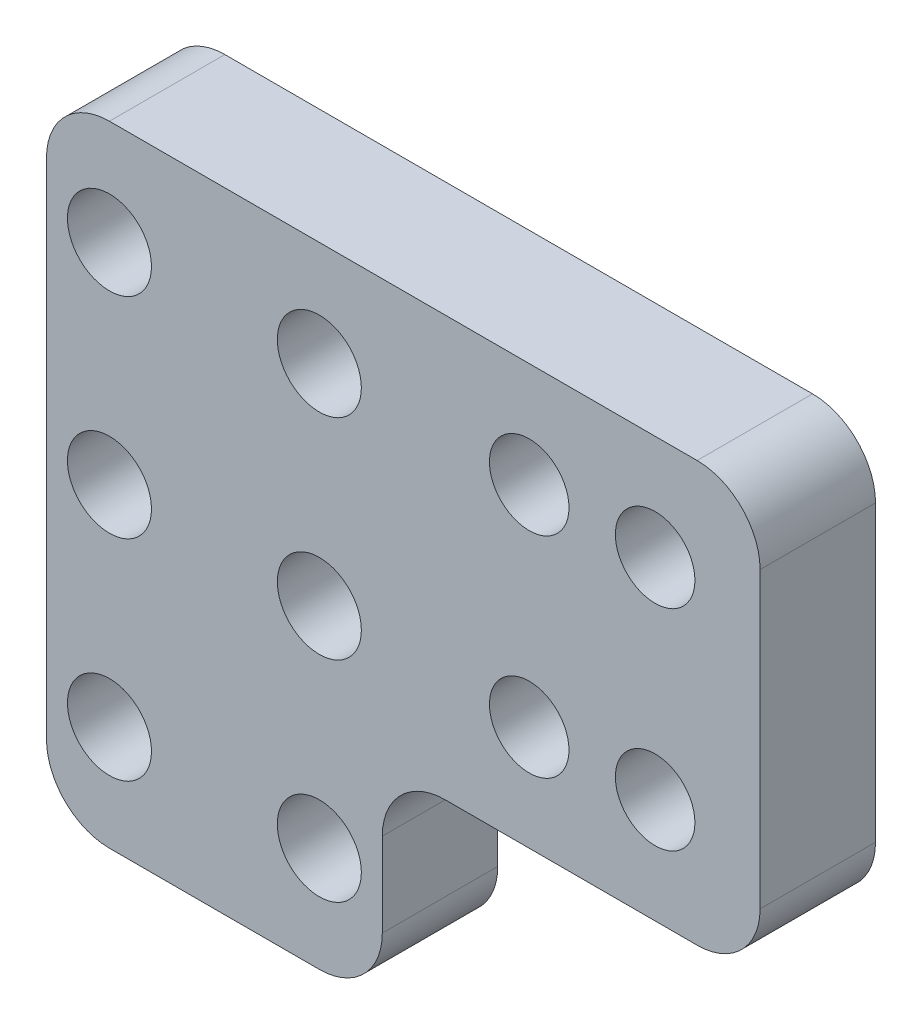
ISO-10303-21;
HEADER;
FILE_DESCRIPTION(('STEP AP214'),'2;1');
FILE_NAME('part.step','',(''),(''),'','','');
FILE_SCHEMA(('AUTOMOTIVE_DESIGN { 1 0 10303 214 1 1 1 1 }'));
ENDSEC;
DATA;
#1=APPLICATION_CONTEXT('core data for automotive mechanical design processes');
#2=APPLICATION_PROTOCOL_DEFINITION('international standard','automotive_design',2000,#1);
#3=PRODUCT_CONTEXT('',#1,'mechanical');
#4=PRODUCT('Part','Part','',(#3));
#5=PRODUCT_RELATED_PRODUCT_CATEGORY('part','',(#4));
#6=PRODUCT_DEFINITION_FORMATION('','',#4);
#7=PRODUCT_DEFINITION_CONTEXT('part definition',#1,'design');
#8=PRODUCT_DEFINITION('design','',#6,#7);
#9=PRODUCT_DEFINITION_SHAPE('','',#8);
#10=(LENGTH_UNIT() NAMED_UNIT(*) SI_UNIT(.MILLI.,.METRE.));
#11=(NAMED_UNIT(*) PLANE_ANGLE_UNIT() SI_UNIT($,.RADIAN.));
#12=(NAMED_UNIT(*) SI_UNIT($,.STERADIAN.) SOLID_ANGLE_UNIT());
#13=UNCERTAINTY_MEASURE_WITH_UNIT(LENGTH_MEASURE(1.E-05),#10,'distance_accuracy_value','');
#14=(GEOMETRIC_REPRESENTATION_CONTEXT(3) GLOBAL_UNCERTAINTY_ASSIGNED_CONTEXT((#13)) GLOBAL_UNIT_ASSIGNED_CONTEXT((#10,
#11,#12)) REPRESENTATION_CONTEXT('',''));
#15=CARTESIAN_POINT('',(0.,0.,0.));
#16=DIRECTION('',(0.,0.,1.));
#17=DIRECTION('',(1.,0.,0.));
#18=AXIS2_PLACEMENT_3D('',#15,#16,#17);
#19=CARTESIAN_POINT('',(0.,0.,5.5));
#20=DIRECTION('',(0.,0.,1.));
#21=DIRECTION('',(1.,0.,0.));
#22=AXIS2_PLACEMENT_3D('',#19,#20,#21);
#23=PLANE('',#22);
#24=CARTESIAN_POINT('',(21.0000000000001,0.,5.5));
#25=DIRECTION('',(0.,0.,1.));
#26=DIRECTION('',(1.,0.,0.));
#27=AXIS2_PLACEMENT_3D('',#24,#25,#26);
#28=CIRCLE('',#27,1.8951052821109);
#29=CARTESIAN_POINT('',(22.895105282111,0.,5.5));
#30=VERTEX_POINT('',#29);
#31=EDGE_CURVE('E283',#30,#30,#28,.T.);
#32=ORIENTED_EDGE('',*,*,#31,.F.);
#33=EDGE_LOOP('',(#32));
#34=FACE_BOUND('',#33,.T.);
#35=CARTESIAN_POINT('',(-4.99999999999979,-9.99999999999999,5.5));
#36=DIRECTION('',(0.,0.,1.));
#37=DIRECTION('',(1.,0.,0.));
#38=AXIS2_PLACEMENT_3D('',#35,#36,#37);
#39=CIRCLE('',#38,2.00172757422963);
#40=CARTESIAN_POINT('',(-2.99827242577017,-9.99999999999999,5.5));
#41=VERTEX_POINT('',#40);
#42=EDGE_CURVE('E271',#41,#41,#39,.T.);
#43=ORIENTED_EDGE('',*,*,#42,.F.);
#44=EDGE_LOOP('',(#43));
#45=FACE_BOUND('',#44,.T.);
#46=CARTESIAN_POINT('',(5.00000000000021,-9.99999999999999,5.5));
#47=DIRECTION('',(0.,0.,1.));
#48=DIRECTION('',(1.,0.,0.));
#49=AXIS2_PLACEMENT_3D('',#46,#47,#48);
#50=CIRCLE('',#49,2.00172757422963);
#51=CARTESIAN_POINT('',(7.00172757422984,-9.99999999999999,5.5));
#52=VERTEX_POINT('',#51);
#53=EDGE_CURVE('E259',#52,#52,#50,.T.);
#54=ORIENTED_EDGE('',*,*,#53,.F.);
#55=EDGE_LOOP('',(#54));
#56=FACE_BOUND('',#55,.T.);
#57=CARTESIAN_POINT('',(5.,10.,5.5));
#58=DIRECTION('',(0.,0.,1.));
#59=DIRECTION('',(1.,0.,0.));
#60=AXIS2_PLACEMENT_3D('',#57,#58,#59);
#61=CIRCLE('',#60,2.00172757422963);
#62=CARTESIAN_POINT('',(7.00172757422963,10.,5.5));
#63=VERTEX_POINT('',#62);
#64=EDGE_CURVE('E247',#63,#63,#61,.T.);
#65=ORIENTED_EDGE('',*,*,#64,.F.);
#66=EDGE_LOOP('',(#65));
#67=FACE_BOUND('',#66,.T.);
#68=CARTESIAN_POINT('',(-5.,10.,5.5));
#69=DIRECTION('',(0.,0.,1.));
#70=DIRECTION('',(1.,0.,0.));
#71=AXIS2_PLACEMENT_3D('',#68,#69,#70);
#72=CIRCLE('',#71,2.00172757422963);
#73=CARTESIAN_POINT('',(-2.99827242577037,10.,5.5));
#74=VERTEX_POINT('',#73);
#75=EDGE_CURVE('E159',#74,#74,#72,.T.);
#76=ORIENTED_EDGE('',*,*,#75,.F.);
#77=EDGE_LOOP('',(#76));
#78=FACE_BOUND('',#77,.T.);
#79=DIRECTION('',(1.,0.,0.));
#80=VECTOR('',#79,1.);
#81=CARTESIAN_POINT('',(-8.,-15.,5.5));
#82=LINE('',#81,#80);
#83=CARTESIAN_POINT('',(-5.,-15.,5.5));
#84=VERTEX_POINT('',#83);
#85=CARTESIAN_POINT('',(5.,-15.,5.5));
#86=VERTEX_POINT('',#85);
#87=EDGE_CURVE('E168',#84,#86,#82,.T.);
#88=ORIENTED_EDGE('',*,*,#87,.T.);
#89=CARTESIAN_POINT('',(5.,-12.,5.5));
#90=DIRECTION('',(0.,0.,1.));
#91=DIRECTION('',(1.,0.,0.));
#92=AXIS2_PLACEMENT_3D('',#89,#90,#91);
#93=CIRCLE('',#92,3.);
#94=CARTESIAN_POINT('',(8.,-12.,5.5));
#95=VERTEX_POINT('',#94);
#96=EDGE_CURVE('E197',#86,#95,#93,.T.);
#97=ORIENTED_EDGE('',*,*,#96,.T.);
#98=DIRECTION('',(0.,1.,0.));
#99=VECTOR('',#98,1.);
#100=CARTESIAN_POINT('',(8.,-5.,5.5));
#101=LINE('',#100,#99);
#102=CARTESIAN_POINT('',(8.,-8.,5.5));
#103=VERTEX_POINT('',#102);
#104=EDGE_CURVE('E151',#95,#103,#101,.T.);
#105=ORIENTED_EDGE('',*,*,#104,.T.);
#106=CARTESIAN_POINT('',(11.,-8.,5.5));
#107=DIRECTION('',(0.,0.,1.));
#108=DIRECTION('',(1.,0.,0.));
#109=AXIS2_PLACEMENT_3D('',#106,#107,#108);
#110=CIRCLE('',#109,3.);
#111=CARTESIAN_POINT('',(11.,-5.,5.5));
#112=VERTEX_POINT('',#111);
#113=EDGE_CURVE('E11',#103,#112,#110,.F.);
#114=ORIENTED_EDGE('',*,*,#113,.T.);
#115=DIRECTION('',(1.,0.,0.));
#116=VECTOR('',#115,1.);
#117=CARTESIAN_POINT('',(26.,-5.,5.5));
#118=LINE('',#117,#116);
#119=CARTESIAN_POINT('',(23.,-5.,5.5));
#120=VERTEX_POINT('',#119);
#121=EDGE_CURVE('E237',#112,#120,#118,.T.);
#122=ORIENTED_EDGE('',*,*,#121,.T.);
#123=CARTESIAN_POINT('',(23.,-2.,5.5));
#124=DIRECTION('',(0.,0.,1.));
#125=DIRECTION('',(1.,0.,0.));
#126=AXIS2_PLACEMENT_3D('',#123,#124,#125);
#127=CIRCLE('',#126,3.);
#128=CARTESIAN_POINT('',(26.,-2.,5.5));
#129=VERTEX_POINT('',#128);
#130=EDGE_CURVE('E193',#120,#129,#127,.T.);
#131=ORIENTED_EDGE('',*,*,#130,.T.);
#132=DIRECTION('',(0.,1.,0.));
#133=VECTOR('',#132,1.);
#134=CARTESIAN_POINT('',(26.,-5.,5.5));
#135=LINE('',#134,#133);
#136=CARTESIAN_POINT('',(26.,12.,5.5));
#137=VERTEX_POINT('',#136);
#138=EDGE_CURVE('E232',#129,#137,#135,.T.);
#139=ORIENTED_EDGE('',*,*,#138,.T.);
#140=CARTESIAN_POINT('',(23.,12.,5.5));
#141=DIRECTION('',(0.,0.,1.));
#142=DIRECTION('',(1.,0.,0.));
#143=AXIS2_PLACEMENT_3D('',#140,#141,#142);
#144=CIRCLE('',#143,3.);
#145=CARTESIAN_POINT('',(23.,15.,5.5));
#146=VERTEX_POINT('',#145);
#147=EDGE_CURVE('E195',#137,#146,#144,.T.);
#148=ORIENTED_EDGE('',*,*,#147,.T.);
#149=DIRECTION('',(-1.,0.,0.));
#150=VECTOR('',#149,1.);
#151=CARTESIAN_POINT('',(26.,15.,5.5));
#152=LINE('',#151,#150);
#153=CARTESIAN_POINT('',(-5.,15.,5.5));
#154=VERTEX_POINT('',#153);
#155=EDGE_CURVE('E231',#146,#154,#152,.T.);
#156=ORIENTED_EDGE('',*,*,#155,.T.);
#157=CARTESIAN_POINT('',(-5.,12.,5.5));
#158=DIRECTION('',(0.,0.,1.));
#159=DIRECTION('',(1.,0.,0.));
#160=AXIS2_PLACEMENT_3D('',#157,#158,#159);
#161=CIRCLE('',#160,3.);
#162=CARTESIAN_POINT('',(-8.,12.,5.5));
#163=VERTEX_POINT('',#162);
#164=EDGE_CURVE('E63',#154,#163,#161,.T.);
#165=ORIENTED_EDGE('',*,*,#164,.T.);
#166=DIRECTION('',(0.,-1.,0.));
#167=VECTOR('',#166,1.);
#168=CARTESIAN_POINT('',(-8.,15.,5.5));
#169=LINE('',#168,#167);
#170=CARTESIAN_POINT('',(-8.,-12.,5.5));
#171=VERTEX_POINT('',#170);
#172=EDGE_CURVE('E220',#163,#171,#169,.T.);
#173=ORIENTED_EDGE('',*,*,#172,.T.);
#174=CARTESIAN_POINT('',(-5.,-12.,5.5));
#175=DIRECTION('',(0.,0.,1.));
#176=DIRECTION('',(1.,0.,0.));
#177=AXIS2_PLACEMENT_3D('',#174,#175,#176);
#178=CIRCLE('',#177,3.);
#179=EDGE_CURVE('E191',#171,#84,#178,.T.);
#180=ORIENTED_EDGE('',*,*,#179,.T.);
#181=EDGE_LOOP('',(#88,#97,#105,#114,#122,#131,#139,#148,#156,#165,#173,#180));
#182=FACE_BOUND('',#181,.T.);
#183=CARTESIAN_POINT('',(15.,10.,5.5));
#184=DIRECTION('',(0.,0.,1.));
#185=DIRECTION('',(1.,0.,0.));
#186=AXIS2_PLACEMENT_3D('',#183,#184,#185);
#187=CIRCLE('',#186,1.8951052821109);
#188=CARTESIAN_POINT('',(16.8951052821109,10.,5.5));
#189=VERTEX_POINT('',#188);
#190=EDGE_CURVE('E242',#189,#189,#187,.T.);
#191=ORIENTED_EDGE('',*,*,#190,.F.);
#192=EDGE_LOOP('',(#191));
#193=FACE_BOUND('',#192,.T.);
#194=CARTESIAN_POINT('',(5.0000000000001,0.,5.5));
#195=DIRECTION('',(0.,0.,1.));
#196=DIRECTION('',(1.,0.,0.));
#197=AXIS2_PLACEMENT_3D('',#194,#195,#196);
#198=CIRCLE('',#197,2.00172757422963);
#199=CARTESIAN_POINT('',(7.00172757422973,0.,5.5));
#200=VERTEX_POINT('',#199);
#201=EDGE_CURVE('E253',#200,#200,#198,.T.);
#202=ORIENTED_EDGE('',*,*,#201,.F.);
#203=EDGE_LOOP('',(#202));
#204=FACE_BOUND('',#203,.T.);
#205=CARTESIAN_POINT('',(-4.9999999999999,0.,5.5));
#206=DIRECTION('',(0.,0.,1.));
#207=DIRECTION('',(1.,0.,0.));
#208=AXIS2_PLACEMENT_3D('',#205,#206,#207);
#209=CIRCLE('',#208,2.00172757422963);
#210=CARTESIAN_POINT('',(-2.99827242577027,0.,5.5));
#211=VERTEX_POINT('',#210);
#212=EDGE_CURVE('E265',#211,#211,#209,.T.);
#213=ORIENTED_EDGE('',*,*,#212,.F.);
#214=EDGE_LOOP('',(#213));
#215=FACE_BOUND('',#214,.T.);
#216=CARTESIAN_POINT('',(21.,10.,5.5));
#217=DIRECTION('',(0.,0.,1.));
#218=DIRECTION('',(1.,0.,0.));
#219=AXIS2_PLACEMENT_3D('',#216,#217,#218);
#220=CIRCLE('',#219,1.8951052821109);
#221=CARTESIAN_POINT('',(22.8951052821109,10.,5.5));
#222=VERTEX_POINT('',#221);
#223=EDGE_CURVE('E277',#222,#222,#220,.T.);
#224=ORIENTED_EDGE('',*,*,#223,.F.);
#225=EDGE_LOOP('',(#224));
#226=FACE_BOUND('',#225,.T.);
#227=CARTESIAN_POINT('',(15.0000000000001,0.,5.5));
#228=DIRECTION('',(0.,0.,1.));
#229=DIRECTION('',(1.,0.,0.));
#230=AXIS2_PLACEMENT_3D('',#227,#228,#229);
#231=CIRCLE('',#230,1.8951052821109);
#232=CARTESIAN_POINT('',(16.895105282111,0.,5.5));
#233=VERTEX_POINT('',#232);
#234=EDGE_CURVE('E289',#233,#233,#231,.T.);
#235=ORIENTED_EDGE('',*,*,#234,.F.);
#236=EDGE_LOOP('',(#235));
#237=FACE_BOUND('',#236,.T.);
#238=ADVANCED_FACE('F41',(#34,#45,#56,#67,#78,#182,#193,#204,#215,#226,#237),#23,.T.);
#239=CARTESIAN_POINT('',(0.,0.,0.));
#240=DIRECTION('',(0.,0.,1.));
#241=DIRECTION('',(1.,0.,0.));
#242=AXIS2_PLACEMENT_3D('',#239,#240,#241);
#243=PLANE('',#242);
#244=DIRECTION('',(0.,1.,0.));
#245=VECTOR('',#244,1.);
#246=CARTESIAN_POINT('',(8.,-5.,0.));
#247=LINE('',#246,#245);
#248=CARTESIAN_POINT('',(8.,-12.,0.));
#249=VERTEX_POINT('',#248);
#250=CARTESIAN_POINT('',(8.,-8.,0.));
#251=VERTEX_POINT('',#250);
#252=EDGE_CURVE('E148',#249,#251,#247,.T.);
#253=ORIENTED_EDGE('',*,*,#252,.F.);
#254=CARTESIAN_POINT('',(5.,-12.,0.));
#255=DIRECTION('',(0.,0.,1.));
#256=DIRECTION('',(1.,0.,0.));
#257=AXIS2_PLACEMENT_3D('',#254,#255,#256);
#258=CIRCLE('',#257,3.);
#259=CARTESIAN_POINT('',(5.,-15.,0.));
#260=VERTEX_POINT('',#259);
#261=EDGE_CURVE('E131',#249,#260,#258,.F.);
#262=ORIENTED_EDGE('',*,*,#261,.T.);
#263=DIRECTION('',(1.,0.,0.));
#264=VECTOR('',#263,1.);
#265=CARTESIAN_POINT('',(-8.,-15.,0.));
#266=LINE('',#265,#264);
#267=CARTESIAN_POINT('',(-5.,-15.,0.));
#268=VERTEX_POINT('',#267);
#269=EDGE_CURVE('E178',#268,#260,#266,.T.);
#270=ORIENTED_EDGE('',*,*,#269,.F.);
#271=CARTESIAN_POINT('',(-5.,-12.,0.));
#272=DIRECTION('',(0.,0.,1.));
#273=DIRECTION('',(1.,0.,0.));
#274=AXIS2_PLACEMENT_3D('',#271,#272,#273);
#275=CIRCLE('',#274,3.);
#276=CARTESIAN_POINT('',(-8.,-12.,0.));
#277=VERTEX_POINT('',#276);
#278=EDGE_CURVE('E182',#268,#277,#275,.F.);
#279=ORIENTED_EDGE('',*,*,#278,.T.);
#280=DIRECTION('',(0.,-1.,0.));
#281=VECTOR('',#280,1.);
#282=CARTESIAN_POINT('',(-8.,15.,0.));
#283=LINE('',#282,#281);
#284=CARTESIAN_POINT('',(-8.,12.,0.));
#285=VERTEX_POINT('',#284);
#286=EDGE_CURVE('E176',#285,#277,#283,.T.);
#287=ORIENTED_EDGE('',*,*,#286,.F.);
#288=CARTESIAN_POINT('',(-5.,12.,0.));
#289=DIRECTION('',(0.,0.,1.));
#290=DIRECTION('',(1.,0.,0.));
#291=AXIS2_PLACEMENT_3D('',#288,#289,#290);
#292=CIRCLE('',#291,3.);
#293=CARTESIAN_POINT('',(-5.,15.,0.));
#294=VERTEX_POINT('',#293);
#295=EDGE_CURVE('E152',#285,#294,#292,.F.);
#296=ORIENTED_EDGE('',*,*,#295,.T.);
#297=DIRECTION('',(-1.,0.,0.));
#298=VECTOR('',#297,1.);
#299=CARTESIAN_POINT('',(-8.,15.,0.));
#300=LINE('',#299,#298);
#301=CARTESIAN_POINT('',(23.,15.,0.));
#302=VERTEX_POINT('',#301);
#303=EDGE_CURVE('E173',#302,#294,#300,.T.);
#304=ORIENTED_EDGE('',*,*,#303,.F.);
#305=CARTESIAN_POINT('',(23.,12.,0.));
#306=DIRECTION('',(0.,0.,1.));
#307=DIRECTION('',(1.,0.,0.));
#308=AXIS2_PLACEMENT_3D('',#305,#306,#307);
#309=CIRCLE('',#308,3.);
#310=CARTESIAN_POINT('',(26.,12.,0.));
#311=VERTEX_POINT('',#310);
#312=EDGE_CURVE('E142',#302,#311,#309,.F.);
#313=ORIENTED_EDGE('',*,*,#312,.T.);
#314=DIRECTION('',(0.,1.,0.));
#315=VECTOR('',#314,1.);
#316=CARTESIAN_POINT('',(26.,-5.,0.));
#317=LINE('',#316,#315);
#318=CARTESIAN_POINT('',(26.,-2.,0.));
#319=VERTEX_POINT('',#318);
#320=EDGE_CURVE('E162',#319,#311,#317,.T.);
#321=ORIENTED_EDGE('',*,*,#320,.F.);
#322=CARTESIAN_POINT('',(23.,-2.,0.));
#323=DIRECTION('',(0.,0.,1.));
#324=DIRECTION('',(1.,0.,0.));
#325=AXIS2_PLACEMENT_3D('',#322,#323,#324);
#326=CIRCLE('',#325,3.);
#327=CARTESIAN_POINT('',(23.,-5.,0.));
#328=VERTEX_POINT('',#327);
#329=EDGE_CURVE('E184',#319,#328,#326,.F.);
#330=ORIENTED_EDGE('',*,*,#329,.T.);
#331=DIRECTION('',(1.,0.,0.));
#332=VECTOR('',#331,1.);
#333=CARTESIAN_POINT('',(26.,-5.,0.));
#334=LINE('',#333,#332);
#335=CARTESIAN_POINT('',(11.,-5.,0.));
#336=VERTEX_POINT('',#335);
#337=EDGE_CURVE('E158',#336,#328,#334,.T.);
#338=ORIENTED_EDGE('',*,*,#337,.F.);
#339=CARTESIAN_POINT('',(11.,-8.,0.));
#340=DIRECTION('',(0.,0.,1.));
#341=DIRECTION('',(1.,0.,0.));
#342=AXIS2_PLACEMENT_3D('',#339,#340,#341);
#343=CIRCLE('',#342,3.);
#344=EDGE_CURVE('E49',#336,#251,#343,.T.);
#345=ORIENTED_EDGE('',*,*,#344,.T.);
#346=EDGE_LOOP('',(#253,#262,#270,#279,#287,#296,#304,#313,#321,#330,#338,#345));
#347=FACE_BOUND('',#346,.T.);
#348=CARTESIAN_POINT('',(-5.,10.,0.));
#349=DIRECTION('',(0.,0.,1.));
#350=DIRECTION('',(1.,0.,0.));
#351=AXIS2_PLACEMENT_3D('',#348,#349,#350);
#352=CIRCLE('',#351,2.00172757422963);
#353=CARTESIAN_POINT('',(-2.99827242577037,10.,0.));
#354=VERTEX_POINT('',#353);
#355=EDGE_CURVE('E165',#354,#354,#352,.T.);
#356=ORIENTED_EDGE('',*,*,#355,.T.);
#357=EDGE_LOOP('',(#356));
#358=FACE_BOUND('',#357,.T.);
#359=CARTESIAN_POINT('',(15.,10.,0.));
#360=DIRECTION('',(0.,0.,1.));
#361=DIRECTION('',(1.,0.,0.));
#362=AXIS2_PLACEMENT_3D('',#359,#360,#361);
#363=CIRCLE('',#362,1.8951052821109);
#364=CARTESIAN_POINT('',(16.8951052821109,10.,0.));
#365=VERTEX_POINT('',#364);
#366=EDGE_CURVE('E244',#365,#365,#363,.T.);
#367=ORIENTED_EDGE('',*,*,#366,.T.);
#368=EDGE_LOOP('',(#367));
#369=FACE_BOUND('',#368,.T.);
#370=CARTESIAN_POINT('',(5.,10.,0.));
#371=DIRECTION('',(0.,0.,1.));
#372=DIRECTION('',(1.,0.,0.));
#373=AXIS2_PLACEMENT_3D('',#370,#371,#372);
#374=CIRCLE('',#373,2.00172757422963);
#375=CARTESIAN_POINT('',(7.00172757422963,10.,0.));
#376=VERTEX_POINT('',#375);
#377=EDGE_CURVE('E250',#376,#376,#374,.T.);
#378=ORIENTED_EDGE('',*,*,#377,.T.);
#379=EDGE_LOOP('',(#378));
#380=FACE_BOUND('',#379,.T.);
#381=CARTESIAN_POINT('',(5.0000000000001,0.,0.));
#382=DIRECTION('',(0.,0.,1.));
#383=DIRECTION('',(1.,0.,0.));
#384=AXIS2_PLACEMENT_3D('',#381,#382,#383);
#385=CIRCLE('',#384,2.00172757422963);
#386=CARTESIAN_POINT('',(7.00172757422973,0.,0.));
#387=VERTEX_POINT('',#386);
#388=EDGE_CURVE('E256',#387,#387,#385,.T.);
#389=ORIENTED_EDGE('',*,*,#388,.T.);
#390=EDGE_LOOP('',(#389));
#391=FACE_BOUND('',#390,.T.);
#392=CARTESIAN_POINT('',(5.00000000000021,-9.99999999999999,0.));
#393=DIRECTION('',(0.,0.,1.));
#394=DIRECTION('',(1.,0.,0.));
#395=AXIS2_PLACEMENT_3D('',#392,#393,#394);
#396=CIRCLE('',#395,2.00172757422963);
#397=CARTESIAN_POINT('',(7.00172757422984,-9.99999999999999,0.));
#398=VERTEX_POINT('',#397);
#399=EDGE_CURVE('E262',#398,#398,#396,.T.);
#400=ORIENTED_EDGE('',*,*,#399,.T.);
#401=EDGE_LOOP('',(#400));
#402=FACE_BOUND('',#401,.T.);
#403=CARTESIAN_POINT('',(-4.9999999999999,0.,0.));
#404=DIRECTION('',(0.,0.,1.));
#405=DIRECTION('',(1.,0.,0.));
#406=AXIS2_PLACEMENT_3D('',#403,#404,#405);
#407=CIRCLE('',#406,2.00172757422963);
#408=CARTESIAN_POINT('',(-2.99827242577027,0.,0.));
#409=VERTEX_POINT('',#408);
#410=EDGE_CURVE('E268',#409,#409,#407,.T.);
#411=ORIENTED_EDGE('',*,*,#410,.T.);
#412=EDGE_LOOP('',(#411));
#413=FACE_BOUND('',#412,.T.);
#414=CARTESIAN_POINT('',(-4.99999999999979,-9.99999999999999,0.));
#415=DIRECTION('',(0.,0.,1.));
#416=DIRECTION('',(1.,0.,0.));
#417=AXIS2_PLACEMENT_3D('',#414,#415,#416);
#418=CIRCLE('',#417,2.00172757422963);
#419=CARTESIAN_POINT('',(-2.99827242577017,-9.99999999999999,0.));
#420=VERTEX_POINT('',#419);
#421=EDGE_CURVE('E274',#420,#420,#418,.T.);
#422=ORIENTED_EDGE('',*,*,#421,.T.);
#423=EDGE_LOOP('',(#422));
#424=FACE_BOUND('',#423,.T.);
#425=CARTESIAN_POINT('',(21.,10.,0.));
#426=DIRECTION('',(0.,0.,1.));
#427=DIRECTION('',(1.,0.,0.));
#428=AXIS2_PLACEMENT_3D('',#425,#426,#427);
#429=CIRCLE('',#428,1.8951052821109);
#430=CARTESIAN_POINT('',(22.8951052821109,10.,0.));
#431=VERTEX_POINT('',#430);
#432=EDGE_CURVE('E280',#431,#431,#429,.T.);
#433=ORIENTED_EDGE('',*,*,#432,.T.);
#434=EDGE_LOOP('',(#433));
#435=FACE_BOUND('',#434,.T.);
#436=CARTESIAN_POINT('',(21.0000000000001,0.,0.));
#437=DIRECTION('',(0.,0.,1.));
#438=DIRECTION('',(1.,0.,0.));
#439=AXIS2_PLACEMENT_3D('',#436,#437,#438);
#440=CIRCLE('',#439,1.8951052821109);
#441=CARTESIAN_POINT('',(22.895105282111,0.,0.));
#442=VERTEX_POINT('',#441);
#443=EDGE_CURVE('E286',#442,#442,#440,.T.);
#444=ORIENTED_EDGE('',*,*,#443,.T.);
#445=EDGE_LOOP('',(#444));
#446=FACE_BOUND('',#445,.T.);
#447=CARTESIAN_POINT('',(15.0000000000001,0.,0.));
#448=DIRECTION('',(0.,0.,1.));
#449=DIRECTION('',(1.,0.,0.));
#450=AXIS2_PLACEMENT_3D('',#447,#448,#449);
#451=CIRCLE('',#450,1.8951052821109);
#452=CARTESIAN_POINT('',(16.895105282111,0.,0.));
#453=VERTEX_POINT('',#452);
#454=EDGE_CURVE('E292',#453,#453,#451,.T.);
#455=ORIENTED_EDGE('',*,*,#454,.T.);
#456=EDGE_LOOP('',(#455));
#457=FACE_BOUND('',#456,.T.);
#458=ADVANCED_FACE('F155',(#347,#358,#369,#380,#391,#402,#413,#424,#435,#446,#457),#243,.F.);
#459=CARTESIAN_POINT('',(8.,-5.,5.5));
#460=DIRECTION('',(-1.,0.,0.));
#461=DIRECTION('',(0.,-1.,0.));
#462=AXIS2_PLACEMENT_3D('',#459,#460,#461);
#463=PLANE('',#462);
#464=ORIENTED_EDGE('',*,*,#104,.F.);
#465=DIRECTION('',(0.,0.,-1.));
#466=VECTOR('',#465,1.);
#467=CARTESIAN_POINT('',(8.,-12.,5.5));
#468=LINE('',#467,#466);
#469=EDGE_CURVE('E135',#95,#249,#468,.T.);
#470=ORIENTED_EDGE('',*,*,#469,.T.);
#471=ORIENTED_EDGE('',*,*,#252,.T.);
#472=DIRECTION('',(0.,0.,-1.));
#473=VECTOR('',#472,1.);
#474=CARTESIAN_POINT('',(8.,-8.,5.5));
#475=LINE('',#474,#473);
#476=EDGE_CURVE('E153',#251,#103,#475,.F.);
#477=ORIENTED_EDGE('',*,*,#476,.T.);
#478=EDGE_LOOP('',(#464,#470,#471,#477));
#479=FACE_BOUND('',#478,.T.);
#480=ADVANCED_FACE('F147',(#479),#463,.F.);
#481=CARTESIAN_POINT('',(26.,-5.,5.5));
#482=DIRECTION('',(0.,1.,0.));
#483=DIRECTION('',(-1.,0.,0.));
#484=AXIS2_PLACEMENT_3D('',#481,#482,#483);
#485=PLANE('',#484);
#486=ORIENTED_EDGE('',*,*,#337,.T.);
#487=DIRECTION('',(0.,0.,-1.));
#488=VECTOR('',#487,1.);
#489=CARTESIAN_POINT('',(23.,-5.,5.5));
#490=LINE('',#489,#488);
#491=EDGE_CURVE('E212',#328,#120,#490,.F.);
#492=ORIENTED_EDGE('',*,*,#491,.T.);
#493=ORIENTED_EDGE('',*,*,#121,.F.);
#494=DIRECTION('',(0.,0.,-1.));
#495=VECTOR('',#494,1.);
#496=CARTESIAN_POINT('',(11.,-5.,0.));
#497=LINE('',#496,#495);
#498=EDGE_CURVE('E209',#112,#336,#497,.T.);
#499=ORIENTED_EDGE('',*,*,#498,.T.);
#500=EDGE_LOOP('',(#486,#492,#493,#499));
#501=FACE_BOUND('',#500,.T.);
#502=ADVANCED_FACE('F325',(#501),#485,.F.);
#503=CARTESIAN_POINT('',(26.,-5.,5.5));
#504=DIRECTION('',(-1.,0.,0.));
#505=DIRECTION('',(0.,0.,1.));
#506=AXIS2_PLACEMENT_3D('',#503,#504,#505);
#507=PLANE('',#506);
#508=ORIENTED_EDGE('',*,*,#320,.T.);
#509=DIRECTION('',(0.,0.,-1.));
#510=VECTOR('',#509,1.);
#511=CARTESIAN_POINT('',(26.,12.,5.5));
#512=LINE('',#511,#510);
#513=EDGE_CURVE('E207',#311,#137,#512,.F.);
#514=ORIENTED_EDGE('',*,*,#513,.T.);
#515=ORIENTED_EDGE('',*,*,#138,.F.);
#516=DIRECTION('',(0.,0.,-1.));
#517=VECTOR('',#516,1.);
#518=CARTESIAN_POINT('',(26.,-2.,5.5));
#519=LINE('',#518,#517);
#520=EDGE_CURVE('E204',#129,#319,#519,.T.);
#521=ORIENTED_EDGE('',*,*,#520,.T.);
#522=EDGE_LOOP('',(#508,#514,#515,#521));
#523=FACE_BOUND('',#522,.T.);
#524=ADVANCED_FACE('F321',(#523),#507,.F.);
#525=CARTESIAN_POINT('',(-8.,15.,5.5));
#526=DIRECTION('',(0.,-1.,0.));
#527=DIRECTION('',(1.,0.,0.));
#528=AXIS2_PLACEMENT_3D('',#525,#526,#527);
#529=PLANE('',#528);
#530=ORIENTED_EDGE('',*,*,#155,.F.);
#531=DIRECTION('',(0.,0.,-1.));
#532=VECTOR('',#531,1.);
#533=CARTESIAN_POINT('',(23.,15.,5.5));
#534=LINE('',#533,#532);
#535=EDGE_CURVE('E201',#146,#302,#534,.T.);
#536=ORIENTED_EDGE('',*,*,#535,.T.);
#537=ORIENTED_EDGE('',*,*,#303,.T.);
#538=DIRECTION('',(0.,0.,-1.));
#539=VECTOR('',#538,1.);
#540=CARTESIAN_POINT('',(-5.,15.,5.5));
#541=LINE('',#540,#539);
#542=EDGE_CURVE('E199',#294,#154,#541,.F.);
#543=ORIENTED_EDGE('',*,*,#542,.T.);
#544=EDGE_LOOP('',(#530,#536,#537,#543));
#545=FACE_BOUND('',#544,.T.);
#546=ADVANCED_FACE('F318',(#545),#529,.F.);
#547=CARTESIAN_POINT('',(-8.,15.,5.5));
#548=DIRECTION('',(1.,0.,0.));
#549=DIRECTION('',(0.,1.,0.));
#550=AXIS2_PLACEMENT_3D('',#547,#548,#549);
#551=PLANE('',#550);
#552=ORIENTED_EDGE('',*,*,#286,.T.);
#553=DIRECTION('',(0.,0.,-1.));
#554=VECTOR('',#553,1.);
#555=CARTESIAN_POINT('',(-8.,-12.,5.5));
#556=LINE('',#555,#554);
#557=EDGE_CURVE('E56',#277,#171,#556,.F.);
#558=ORIENTED_EDGE('',*,*,#557,.T.);
#559=ORIENTED_EDGE('',*,*,#172,.F.);
#560=DIRECTION('',(0.,0.,-1.));
#561=VECTOR('',#560,1.);
#562=CARTESIAN_POINT('',(-8.,12.,5.5));
#563=LINE('',#562,#561);
#564=EDGE_CURVE('E214',#163,#285,#563,.T.);
#565=ORIENTED_EDGE('',*,*,#564,.T.);
#566=EDGE_LOOP('',(#552,#558,#559,#565));
#567=FACE_BOUND('',#566,.T.);
#568=ADVANCED_FACE('F219',(#567),#551,.F.);
#569=CARTESIAN_POINT('',(-8.,-15.,5.5));
#570=DIRECTION('',(0.,1.,0.));
#571=DIRECTION('',(0.,0.,1.));
#572=AXIS2_PLACEMENT_3D('',#569,#570,#571);
#573=PLANE('',#572);
#574=ORIENTED_EDGE('',*,*,#269,.T.);
#575=DIRECTION('',(0.,0.,-1.));
#576=VECTOR('',#575,1.);
#577=CARTESIAN_POINT('',(5.,-15.,5.5));
#578=LINE('',#577,#576);
#579=EDGE_CURVE('E136',#260,#86,#578,.F.);
#580=ORIENTED_EDGE('',*,*,#579,.T.);
#581=ORIENTED_EDGE('',*,*,#87,.F.);
#582=DIRECTION('',(0.,0.,-1.));
#583=VECTOR('',#582,1.);
#584=CARTESIAN_POINT('',(-5.,-15.,5.5));
#585=LINE('',#584,#583);
#586=EDGE_CURVE('E141',#84,#268,#585,.T.);
#587=ORIENTED_EDGE('',*,*,#586,.T.);
#588=EDGE_LOOP('',(#574,#580,#581,#587));
#589=FACE_BOUND('',#588,.T.);
#590=ADVANCED_FACE('F229',(#589),#573,.F.);
#591=CARTESIAN_POINT('',(-5.,10.,5.5));
#592=DIRECTION('',(0.,0.,-1.));
#593=DIRECTION('',(-1.,0.,0.));
#594=AXIS2_PLACEMENT_3D('',#591,#592,#593);
#595=CYLINDRICAL_SURFACE('',#594,2.00172757422963);
#596=ORIENTED_EDGE('',*,*,#75,.T.);
#597=EDGE_LOOP('',(#596));
#598=FACE_BOUND('',#597,.T.);
#599=ORIENTED_EDGE('',*,*,#355,.F.);
#600=EDGE_LOOP('',(#599));
#601=FACE_BOUND('',#600,.T.);
#602=ADVANCED_FACE('F311',(#598,#601),#595,.F.);
#603=CARTESIAN_POINT('',(15.,10.,5.5));
#604=DIRECTION('',(0.,0.,-1.));
#605=DIRECTION('',(-1.,0.,0.));
#606=AXIS2_PLACEMENT_3D('',#603,#604,#605);
#607=CYLINDRICAL_SURFACE('',#606,1.8951052821109);
#608=ORIENTED_EDGE('',*,*,#190,.T.);
#609=EDGE_LOOP('',(#608));
#610=FACE_BOUND('',#609,.T.);
#611=ORIENTED_EDGE('',*,*,#366,.F.);
#612=EDGE_LOOP('',(#611));
#613=FACE_BOUND('',#612,.T.);
#614=ADVANCED_FACE('F410',(#610,#613),#607,.F.);
#615=CARTESIAN_POINT('',(5.,10.,5.5));
#616=DIRECTION('',(0.,0.,-1.));
#617=DIRECTION('',(-1.,0.,0.));
#618=AXIS2_PLACEMENT_3D('',#615,#616,#617);
#619=CYLINDRICAL_SURFACE('',#618,2.00172757422963);
#620=ORIENTED_EDGE('',*,*,#64,.T.);
#621=EDGE_LOOP('',(#620));
#622=FACE_BOUND('',#621,.T.);
#623=ORIENTED_EDGE('',*,*,#377,.F.);
#624=EDGE_LOOP('',(#623));
#625=FACE_BOUND('',#624,.T.);
#626=ADVANCED_FACE('F407',(#622,#625),#619,.F.);
#627=CARTESIAN_POINT('',(5.0000000000001,0.,5.5));
#628=DIRECTION('',(0.,0.,-1.));
#629=DIRECTION('',(-1.,0.,0.));
#630=AXIS2_PLACEMENT_3D('',#627,#628,#629);
#631=CYLINDRICAL_SURFACE('',#630,2.00172757422963);
#632=ORIENTED_EDGE('',*,*,#201,.T.);
#633=EDGE_LOOP('',(#632));
#634=FACE_BOUND('',#633,.T.);
#635=ORIENTED_EDGE('',*,*,#388,.F.);
#636=EDGE_LOOP('',(#635));
#637=FACE_BOUND('',#636,.T.);
#638=ADVANCED_FACE('F403',(#634,#637),#631,.F.);
#639=CARTESIAN_POINT('',(5.00000000000021,-9.99999999999999,5.5));
#640=DIRECTION('',(0.,0.,-1.));
#641=DIRECTION('',(-1.,0.,0.));
#642=AXIS2_PLACEMENT_3D('',#639,#640,#641);
#643=CYLINDRICAL_SURFACE('',#642,2.00172757422963);
#644=ORIENTED_EDGE('',*,*,#53,.T.);
#645=EDGE_LOOP('',(#644));
#646=FACE_BOUND('',#645,.T.);
#647=ORIENTED_EDGE('',*,*,#399,.F.);
#648=EDGE_LOOP('',(#647));
#649=FACE_BOUND('',#648,.T.);
#650=ADVANCED_FACE('F399',(#646,#649),#643,.F.);
#651=CARTESIAN_POINT('',(-4.9999999999999,0.,5.5));
#652=DIRECTION('',(0.,0.,-1.));
#653=DIRECTION('',(-1.,0.,0.));
#654=AXIS2_PLACEMENT_3D('',#651,#652,#653);
#655=CYLINDRICAL_SURFACE('',#654,2.00172757422963);
#656=ORIENTED_EDGE('',*,*,#212,.T.);
#657=EDGE_LOOP('',(#656));
#658=FACE_BOUND('',#657,.T.);
#659=ORIENTED_EDGE('',*,*,#410,.F.);
#660=EDGE_LOOP('',(#659));
#661=FACE_BOUND('',#660,.T.);
#662=ADVANCED_FACE('F395',(#658,#661),#655,.F.);
#663=CARTESIAN_POINT('',(-4.99999999999979,-9.99999999999999,5.5));
#664=DIRECTION('',(0.,0.,-1.));
#665=DIRECTION('',(-1.,0.,0.));
#666=AXIS2_PLACEMENT_3D('',#663,#664,#665);
#667=CYLINDRICAL_SURFACE('',#666,2.00172757422963);
#668=ORIENTED_EDGE('',*,*,#42,.T.);
#669=EDGE_LOOP('',(#668));
#670=FACE_BOUND('',#669,.T.);
#671=ORIENTED_EDGE('',*,*,#421,.F.);
#672=EDGE_LOOP('',(#671));
#673=FACE_BOUND('',#672,.T.);
#674=ADVANCED_FACE('F377',(#670,#673),#667,.F.);
#675=CARTESIAN_POINT('',(21.,10.,5.5));
#676=DIRECTION('',(0.,0.,-1.));
#677=DIRECTION('',(-1.,0.,0.));
#678=AXIS2_PLACEMENT_3D('',#675,#676,#677);
#679=CYLINDRICAL_SURFACE('',#678,1.8951052821109);
#680=ORIENTED_EDGE('',*,*,#223,.T.);
#681=EDGE_LOOP('',(#680));
#682=FACE_BOUND('',#681,.T.);
#683=ORIENTED_EDGE('',*,*,#432,.F.);
#684=EDGE_LOOP('',(#683));
#685=FACE_BOUND('',#684,.T.);
#686=ADVANCED_FACE('F373',(#682,#685),#679,.F.);
#687=CARTESIAN_POINT('',(21.0000000000001,0.,5.5));
#688=DIRECTION('',(0.,0.,-1.));
#689=DIRECTION('',(-1.,0.,0.));
#690=AXIS2_PLACEMENT_3D('',#687,#688,#689);
#691=CYLINDRICAL_SURFACE('',#690,1.8951052821109);
#692=ORIENTED_EDGE('',*,*,#31,.T.);
#693=EDGE_LOOP('',(#692));
#694=FACE_BOUND('',#693,.T.);
#695=ORIENTED_EDGE('',*,*,#443,.F.);
#696=EDGE_LOOP('',(#695));
#697=FACE_BOUND('',#696,.T.);
#698=ADVANCED_FACE('F376',(#694,#697),#691,.F.);
#699=CARTESIAN_POINT('',(15.0000000000001,0.,5.5));
#700=DIRECTION('',(0.,0.,-1.));
#701=DIRECTION('',(-1.,0.,0.));
#702=AXIS2_PLACEMENT_3D('',#699,#700,#701);
#703=CYLINDRICAL_SURFACE('',#702,1.8951052821109);
#704=ORIENTED_EDGE('',*,*,#234,.T.);
#705=EDGE_LOOP('',(#704));
#706=FACE_BOUND('',#705,.T.);
#707=ORIENTED_EDGE('',*,*,#454,.F.);
#708=EDGE_LOOP('',(#707));
#709=FACE_BOUND('',#708,.T.);
#710=ADVANCED_FACE('F298',(#706,#709),#703,.F.);
#711=CARTESIAN_POINT('',(5.,-12.,5.5));
#712=DIRECTION('',(0.,0.,-1.));
#713=DIRECTION('',(-1.,0.,0.));
#714=AXIS2_PLACEMENT_3D('',#711,#712,#713);
#715=CYLINDRICAL_SURFACE('',#714,3.);
#716=ORIENTED_EDGE('',*,*,#96,.F.);
#717=ORIENTED_EDGE('',*,*,#579,.F.);
#718=ORIENTED_EDGE('',*,*,#261,.F.);
#719=ORIENTED_EDGE('',*,*,#469,.F.);
#720=EDGE_LOOP('',(#716,#717,#718,#719));
#721=FACE_BOUND('',#720,.T.);
#722=ADVANCED_FACE('F134',(#721),#715,.T.);
#723=CARTESIAN_POINT('',(23.,12.,5.5));
#724=DIRECTION('',(0.,0.,-1.));
#725=DIRECTION('',(-1.,0.,0.));
#726=AXIS2_PLACEMENT_3D('',#723,#724,#725);
#727=CYLINDRICAL_SURFACE('',#726,3.);
#728=ORIENTED_EDGE('',*,*,#147,.F.);
#729=ORIENTED_EDGE('',*,*,#513,.F.);
#730=ORIENTED_EDGE('',*,*,#312,.F.);
#731=ORIENTED_EDGE('',*,*,#535,.F.);
#732=EDGE_LOOP('',(#728,#729,#730,#731));
#733=FACE_BOUND('',#732,.T.);
#734=ADVANCED_FACE('F334',(#733),#727,.T.);
#735=CARTESIAN_POINT('',(23.,-2.,5.5));
#736=DIRECTION('',(0.,0.,-1.));
#737=DIRECTION('',(-1.,0.,0.));
#738=AXIS2_PLACEMENT_3D('',#735,#736,#737);
#739=CYLINDRICAL_SURFACE('',#738,3.);
#740=ORIENTED_EDGE('',*,*,#130,.F.);
#741=ORIENTED_EDGE('',*,*,#491,.F.);
#742=ORIENTED_EDGE('',*,*,#329,.F.);
#743=ORIENTED_EDGE('',*,*,#520,.F.);
#744=EDGE_LOOP('',(#740,#741,#742,#743));
#745=FACE_BOUND('',#744,.T.);
#746=ADVANCED_FACE('F337',(#745),#739,.T.);
#747=CARTESIAN_POINT('',(11.,-8.,5.5));
#748=DIRECTION('',(0.,0.,1.));
#749=DIRECTION('',(1.,0.,0.));
#750=AXIS2_PLACEMENT_3D('',#747,#748,#749);
#751=CYLINDRICAL_SURFACE('',#750,3.);
#752=ORIENTED_EDGE('',*,*,#113,.F.);
#753=ORIENTED_EDGE('',*,*,#476,.F.);
#754=ORIENTED_EDGE('',*,*,#344,.F.);
#755=ORIENTED_EDGE('',*,*,#498,.F.);
#756=EDGE_LOOP('',(#752,#753,#754,#755));
#757=FACE_BOUND('',#756,.T.);
#758=ADVANCED_FACE('F341',(#757),#751,.F.);
#759=CARTESIAN_POINT('',(-5.,-12.,5.5));
#760=DIRECTION('',(0.,0.,-1.));
#761=DIRECTION('',(-1.,0.,0.));
#762=AXIS2_PLACEMENT_3D('',#759,#760,#761);
#763=CYLINDRICAL_SURFACE('',#762,3.);
#764=ORIENTED_EDGE('',*,*,#179,.F.);
#765=ORIENTED_EDGE('',*,*,#557,.F.);
#766=ORIENTED_EDGE('',*,*,#278,.F.);
#767=ORIENTED_EDGE('',*,*,#586,.F.);
#768=EDGE_LOOP('',(#764,#765,#766,#767));
#769=FACE_BOUND('',#768,.T.);
#770=ADVANCED_FACE('F226',(#769),#763,.T.);
#771=CARTESIAN_POINT('',(-5.,12.,5.5));
#772=DIRECTION('',(0.,0.,-1.));
#773=DIRECTION('',(-1.,0.,0.));
#774=AXIS2_PLACEMENT_3D('',#771,#772,#773);
#775=CYLINDRICAL_SURFACE('',#774,3.);
#776=ORIENTED_EDGE('',*,*,#164,.F.);
#777=ORIENTED_EDGE('',*,*,#542,.F.);
#778=ORIENTED_EDGE('',*,*,#295,.F.);
#779=ORIENTED_EDGE('',*,*,#564,.F.);
#780=EDGE_LOOP('',(#776,#777,#778,#779));
#781=FACE_BOUND('',#780,.T.);
#782=ADVANCED_FACE('F43',(#781),#775,.T.);
#783=CLOSED_SHELL('',(#238,#458,#480,#502,#524,#546,#568,#590,#602,#614,#626,#638,#650,#662,
#674,#686,#698,#710,#722,#734,#746,#758,#770,#782));
#784=MANIFOLD_SOLID_BREP('B2',#783);
#785=ADVANCED_BREP_SHAPE_REPRESENTATION('',(#18,#784),#14);
#786=SHAPE_DEFINITION_REPRESENTATION(#9,#785);
ENDSEC;
END-ISO-10303-21;
